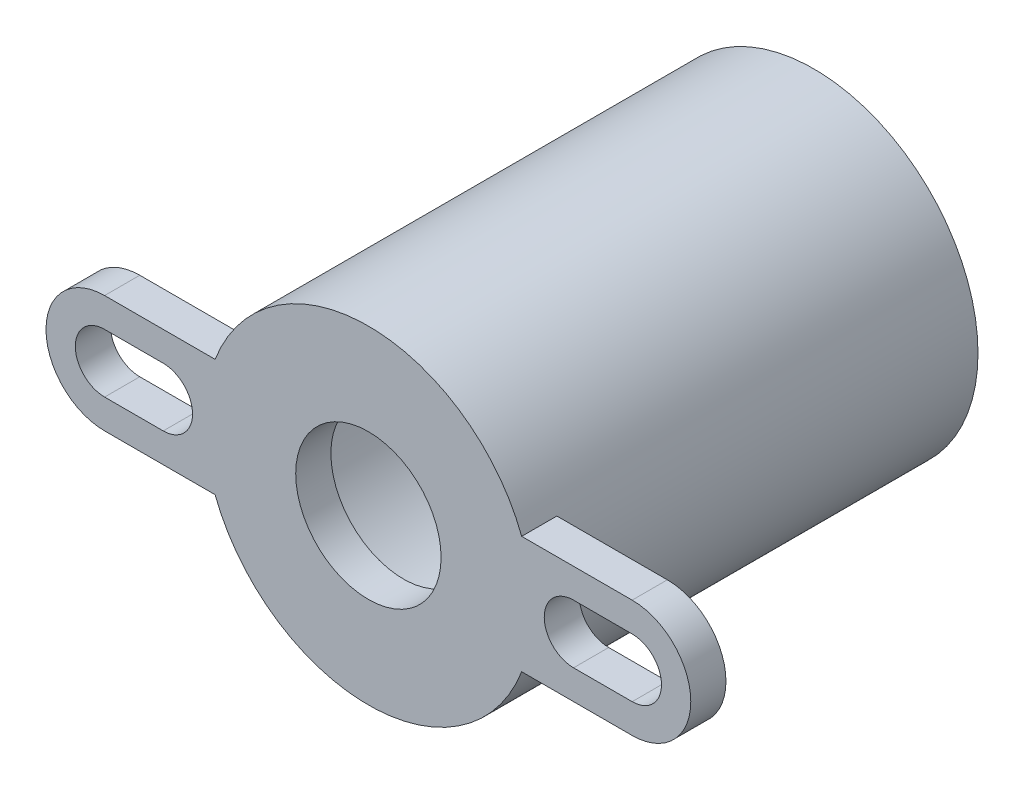
ISO-10303-21;
HEADER;
FILE_DESCRIPTION(('STEP AP214'),'2;1');
FILE_NAME('part.step','',(''),(''),'','','');
FILE_SCHEMA(('AUTOMOTIVE_DESIGN { 1 0 10303 214 1 1 1 1 }'));
ENDSEC;
DATA;
#1=APPLICATION_CONTEXT('core data for automotive mechanical design processes');
#2=APPLICATION_PROTOCOL_DEFINITION('international standard','automotive_design',2000,#1);
#3=PRODUCT_CONTEXT('',#1,'mechanical');
#4=PRODUCT('Part','Part','',(#3));
#5=PRODUCT_RELATED_PRODUCT_CATEGORY('part','',(#4));
#6=PRODUCT_DEFINITION_FORMATION('','',#4);
#7=PRODUCT_DEFINITION_CONTEXT('part definition',#1,'design');
#8=PRODUCT_DEFINITION('design','',#6,#7);
#9=PRODUCT_DEFINITION_SHAPE('','',#8);
#10=(LENGTH_UNIT() NAMED_UNIT(*) SI_UNIT(.MILLI.,.METRE.));
#11=(NAMED_UNIT(*) PLANE_ANGLE_UNIT() SI_UNIT($,.RADIAN.));
#12=(NAMED_UNIT(*) SI_UNIT($,.STERADIAN.) SOLID_ANGLE_UNIT());
#13=UNCERTAINTY_MEASURE_WITH_UNIT(LENGTH_MEASURE(1.E-05),#10,'distance_accuracy_value','');
#14=(GEOMETRIC_REPRESENTATION_CONTEXT(3) GLOBAL_UNCERTAINTY_ASSIGNED_CONTEXT((#13)) GLOBAL_UNIT_ASSIGNED_CONTEXT((#10,
#11,#12)) REPRESENTATION_CONTEXT('',''));
#15=CARTESIAN_POINT('',(0.,0.,0.));
#16=DIRECTION('',(0.,0.,1.));
#17=DIRECTION('',(1.,0.,0.));
#18=AXIS2_PLACEMENT_3D('',#15,#16,#17);
#19=CARTESIAN_POINT('',(0.,0.,0.));
#20=DIRECTION('',(0.,0.,1.));
#21=DIRECTION('',(1.,0.,0.));
#22=AXIS2_PLACEMENT_3D('',#19,#20,#21);
#23=PLANE('',#22);
#24=DIRECTION('',(1.,0.,0.));
#25=VECTOR('',#24,1.);
#26=CARTESIAN_POINT('',(40.,2.5,0.));
#27=LINE('',#26,#25);
#28=CARTESIAN_POINT('',(40.,2.5,0.));
#29=VERTEX_POINT('',#28);
#30=CARTESIAN_POINT('',(45.,2.5,0.));
#31=VERTEX_POINT('',#30);
#32=EDGE_CURVE('E179',#29,#31,#27,.T.);
#33=ORIENTED_EDGE('',*,*,#32,.F.);
#34=CARTESIAN_POINT('',(40.,0.,0.));
#35=DIRECTION('',(0.,0.,-1.));
#36=DIRECTION('',(-1.,0.,0.));
#37=AXIS2_PLACEMENT_3D('',#34,#35,#36);
#38=CIRCLE('',#37,2.5);
#39=CARTESIAN_POINT('',(40.,-2.5,0.));
#40=VERTEX_POINT('',#39);
#41=EDGE_CURVE('E54',#40,#29,#38,.T.);
#42=ORIENTED_EDGE('',*,*,#41,.F.);
#43=DIRECTION('',(-1.,0.,0.));
#44=VECTOR('',#43,1.);
#45=CARTESIAN_POINT('',(40.,-2.5,0.));
#46=LINE('',#45,#44);
#47=CARTESIAN_POINT('',(45.,-2.5,0.));
#48=VERTEX_POINT('',#47);
#49=EDGE_CURVE('E170',#48,#40,#46,.T.);
#50=ORIENTED_EDGE('',*,*,#49,.F.);
#51=CARTESIAN_POINT('',(45.,0.,0.));
#52=DIRECTION('',(0.,0.,-1.));
#53=DIRECTION('',(-1.,0.,0.));
#54=AXIS2_PLACEMENT_3D('',#51,#52,#53);
#55=CIRCLE('',#54,2.5);
#56=EDGE_CURVE('E173',#31,#48,#55,.T.);
#57=ORIENTED_EDGE('',*,*,#56,.F.);
#58=EDGE_LOOP('',(#33,#42,#50,#57));
#59=FACE_BOUND('',#58,.T.);
#60=CARTESIAN_POINT('',(22.5,0.,0.));
#61=DIRECTION('',(0.,0.,-1.));
#62=DIRECTION('',(-1.,0.,0.));
#63=AXIS2_PLACEMENT_3D('',#60,#61,#62);
#64=CIRCLE('',#63,14.);
#65=CARTESIAN_POINT('',(35.576696830622,5.,0.));
#66=VERTEX_POINT('',#65);
#67=CARTESIAN_POINT('',(35.576696830622,-5.,0.));
#68=VERTEX_POINT('',#67);
#69=EDGE_CURVE('E11',#66,#68,#64,.T.);
#70=ORIENTED_EDGE('',*,*,#69,.F.);
#71=DIRECTION('',(1.,0.,0.));
#72=VECTOR('',#71,1.);
#73=CARTESIAN_POINT('',(0.,5.,0.));
#74=LINE('',#73,#72);
#75=CARTESIAN_POINT('',(45.,5.,0.));
#76=VERTEX_POINT('',#75);
#77=EDGE_CURVE('E264',#66,#76,#74,.T.);
#78=ORIENTED_EDGE('',*,*,#77,.T.);
#79=CARTESIAN_POINT('',(45.,0.,0.));
#80=DIRECTION('',(0.,0.,1.));
#81=DIRECTION('',(1.,0.,0.));
#82=AXIS2_PLACEMENT_3D('',#79,#80,#81);
#83=CIRCLE('',#82,5.);
#84=CARTESIAN_POINT('',(45.,-5.,0.));
#85=VERTEX_POINT('',#84);
#86=EDGE_CURVE('E261',#85,#76,#83,.T.);
#87=ORIENTED_EDGE('',*,*,#86,.F.);
#88=DIRECTION('',(1.,0.,0.));
#89=VECTOR('',#88,1.);
#90=CARTESIAN_POINT('',(0.,-5.,0.));
#91=LINE('',#90,#89);
#92=EDGE_CURVE('E259',#68,#85,#91,.T.);
#93=ORIENTED_EDGE('',*,*,#92,.F.);
#94=EDGE_LOOP('',(#70,#78,#87,#93));
#95=FACE_BOUND('',#94,.T.);
#96=ADVANCED_FACE('F37',(#59,#95),#23,.F.);
#97=CARTESIAN_POINT('',(22.5,0.,0.));
#98=DIRECTION('',(0.,0.,-1.));
#99=DIRECTION('',(-1.,0.,0.));
#100=AXIS2_PLACEMENT_3D('',#97,#98,#99);
#101=CIRCLE('',#100,6.2);
#102=CARTESIAN_POINT('',(16.3,0.,0.));
#103=VERTEX_POINT('',#102);
#104=EDGE_CURVE('E228',#103,#103,#101,.T.);
#105=ORIENTED_EDGE('',*,*,#104,.F.);
#106=EDGE_LOOP('',(#105));
#107=FACE_BOUND('',#106,.T.);
#108=CARTESIAN_POINT('',(22.5,0.,0.));
#109=DIRECTION('',(0.,0.,-1.));
#110=DIRECTION('',(-1.,0.,0.));
#111=AXIS2_PLACEMENT_3D('',#108,#109,#110);
#112=CIRCLE('',#111,11.5);
#113=CARTESIAN_POINT('',(11.,0.,0.));
#114=VERTEX_POINT('',#113);
#115=EDGE_CURVE('E186',#114,#114,#112,.T.);
#116=ORIENTED_EDGE('',*,*,#115,.T.);
#117=EDGE_LOOP('',(#116));
#118=FACE_BOUND('',#117,.T.);
#119=ADVANCED_FACE('F334',(#107,#118),#23,.F.);
#120=CARTESIAN_POINT('',(0.,-5.,3.));
#121=DIRECTION('',(0.,1.,0.));
#122=DIRECTION('',(0.,0.,1.));
#123=AXIS2_PLACEMENT_3D('',#120,#121,#122);
#124=PLANE('',#123);
#125=DIRECTION('',(1.,0.,0.));
#126=VECTOR('',#125,1.);
#127=CARTESIAN_POINT('',(0.,-5.,0.));
#128=LINE('',#127,#126);
#129=CARTESIAN_POINT('',(0.,-5.,0.));
#130=VERTEX_POINT('',#129);
#131=CARTESIAN_POINT('',(9.42330316937798,-5.,0.));
#132=VERTEX_POINT('',#131);
#133=EDGE_CURVE('E235',#130,#132,#128,.T.);
#134=ORIENTED_EDGE('',*,*,#133,.T.);
#135=DIRECTION('',(0.,0.,-1.));
#136=VECTOR('',#135,1.);
#137=CARTESIAN_POINT('',(9.42330316937798,-5.,3.));
#138=LINE('',#137,#136);
#139=CARTESIAN_POINT('',(9.42330316937798,-5.,3.));
#140=VERTEX_POINT('',#139);
#141=EDGE_CURVE('E41',#140,#132,#138,.T.);
#142=ORIENTED_EDGE('',*,*,#141,.F.);
#143=DIRECTION('',(1.,0.,0.));
#144=VECTOR('',#143,1.);
#145=CARTESIAN_POINT('',(0.,-5.,3.));
#146=LINE('',#145,#144);
#147=CARTESIAN_POINT('',(0.,-5.,3.));
#148=VERTEX_POINT('',#147);
#149=EDGE_CURVE('E236',#148,#140,#146,.T.);
#150=ORIENTED_EDGE('',*,*,#149,.F.);
#151=DIRECTION('',(0.,0.,-1.));
#152=VECTOR('',#151,1.);
#153=CARTESIAN_POINT('',(0.,-5.,3.));
#154=LINE('',#153,#152);
#155=EDGE_CURVE('E256',#148,#130,#154,.T.);
#156=ORIENTED_EDGE('',*,*,#155,.T.);
#157=EDGE_LOOP('',(#134,#142,#150,#156));
#158=FACE_BOUND('',#157,.T.);
#159=ADVANCED_FACE('F39',(#158),#124,.F.);
#160=CARTESIAN_POINT('',(0.,-5.,3.));
#161=DIRECTION('',(0.,1.,0.));
#162=DIRECTION('',(0.,0.,1.));
#163=AXIS2_PLACEMENT_3D('',#160,#161,#162);
#164=PLANE('',#163);
#165=ORIENTED_EDGE('',*,*,#92,.T.);
#166=DIRECTION('',(0.,0.,-1.));
#167=VECTOR('',#166,1.);
#168=CARTESIAN_POINT('',(45.,-5.,3.));
#169=LINE('',#168,#167);
#170=CARTESIAN_POINT('',(45.,-5.,3.));
#171=VERTEX_POINT('',#170);
#172=EDGE_CURVE('E282',#171,#85,#169,.T.);
#173=ORIENTED_EDGE('',*,*,#172,.F.);
#174=DIRECTION('',(1.,0.,0.));
#175=VECTOR('',#174,1.);
#176=CARTESIAN_POINT('',(0.,-5.,3.));
#177=LINE('',#176,#175);
#178=CARTESIAN_POINT('',(35.576696830622,-5.,3.));
#179=VERTEX_POINT('',#178);
#180=EDGE_CURVE('E242',#179,#171,#177,.T.);
#181=ORIENTED_EDGE('',*,*,#180,.F.);
#182=DIRECTION('',(0.,0.,-1.));
#183=VECTOR('',#182,1.);
#184=CARTESIAN_POINT('',(35.576696830622,-5.,3.));
#185=LINE('',#184,#183);
#186=EDGE_CURVE('E284',#179,#68,#185,.T.);
#187=ORIENTED_EDGE('',*,*,#186,.T.);
#188=EDGE_LOOP('',(#165,#173,#181,#187));
#189=FACE_BOUND('',#188,.T.);
#190=ADVANCED_FACE('F316',(#189),#164,.F.);
#191=CARTESIAN_POINT('',(45.,0.,3.));
#192=DIRECTION('',(0.,0.,-1.));
#193=DIRECTION('',(-1.,0.,0.));
#194=AXIS2_PLACEMENT_3D('',#191,#192,#193);
#195=CYLINDRICAL_SURFACE('',#194,5.);
#196=ORIENTED_EDGE('',*,*,#86,.T.);
#197=DIRECTION('',(0.,0.,-1.));
#198=VECTOR('',#197,1.);
#199=CARTESIAN_POINT('',(45.,5.,3.));
#200=LINE('',#199,#198);
#201=CARTESIAN_POINT('',(45.,5.,3.));
#202=VERTEX_POINT('',#201);
#203=EDGE_CURVE('E280',#202,#76,#200,.T.);
#204=ORIENTED_EDGE('',*,*,#203,.F.);
#205=CARTESIAN_POINT('',(45.,0.,3.));
#206=DIRECTION('',(0.,0.,1.));
#207=DIRECTION('',(1.,0.,0.));
#208=AXIS2_PLACEMENT_3D('',#205,#206,#207);
#209=CIRCLE('',#208,5.);
#210=EDGE_CURVE('E244',#171,#202,#209,.T.);
#211=ORIENTED_EDGE('',*,*,#210,.F.);
#212=ORIENTED_EDGE('',*,*,#172,.T.);
#213=EDGE_LOOP('',(#196,#204,#211,#212));
#214=FACE_BOUND('',#213,.T.);
#215=ADVANCED_FACE('F319',(#214),#195,.T.);
#216=CARTESIAN_POINT('',(0.,5.,3.));
#217=DIRECTION('',(0.,1.,0.));
#218=DIRECTION('',(0.,0.,1.));
#219=AXIS2_PLACEMENT_3D('',#216,#217,#218);
#220=PLANE('',#219);
#221=ORIENTED_EDGE('',*,*,#77,.F.);
#222=DIRECTION('',(0.,0.,-1.));
#223=VECTOR('',#222,1.);
#224=CARTESIAN_POINT('',(35.576696830622,5.,3.));
#225=LINE('',#224,#223);
#226=CARTESIAN_POINT('',(35.576696830622,5.,3.));
#227=VERTEX_POINT('',#226);
#228=EDGE_CURVE('E277',#227,#66,#225,.T.);
#229=ORIENTED_EDGE('',*,*,#228,.F.);
#230=DIRECTION('',(1.,0.,0.));
#231=VECTOR('',#230,1.);
#232=CARTESIAN_POINT('',(0.,5.,3.));
#233=LINE('',#232,#231);
#234=EDGE_CURVE('E246',#227,#202,#233,.T.);
#235=ORIENTED_EDGE('',*,*,#234,.T.);
#236=ORIENTED_EDGE('',*,*,#203,.T.);
#237=EDGE_LOOP('',(#221,#229,#235,#236));
#238=FACE_BOUND('',#237,.T.);
#239=ADVANCED_FACE('F311',(#238),#220,.T.);
#240=CARTESIAN_POINT('',(22.5,0.,3.));
#241=DIRECTION('',(0.,0.,-1.));
#242=DIRECTION('',(-1.,0.,0.));
#243=AXIS2_PLACEMENT_3D('',#240,#241,#242);
#244=CYLINDRICAL_SURFACE('',#243,14.);
#245=ORIENTED_EDGE('',*,*,#228,.T.);
#246=ORIENTED_EDGE('',*,*,#69,.T.);
#247=ORIENTED_EDGE('',*,*,#186,.F.);
#248=CARTESIAN_POINT('',(22.5,0.,3.));
#249=DIRECTION('',(0.,0.,1.));
#250=DIRECTION('',(1.,0.,0.));
#251=AXIS2_PLACEMENT_3D('',#248,#249,#250);
#252=CIRCLE('',#251,14.);
#253=EDGE_CURVE('E239',#140,#179,#252,.T.);
#254=ORIENTED_EDGE('',*,*,#253,.F.);
#255=ORIENTED_EDGE('',*,*,#141,.T.);
#256=CARTESIAN_POINT('',(9.42330316937798,5.,0.));
#257=VERTEX_POINT('',#256);
#258=EDGE_CURVE('E46',#132,#257,#64,.T.);
#259=ORIENTED_EDGE('',*,*,#258,.T.);
#260=DIRECTION('',(0.,0.,-1.));
#261=VECTOR('',#260,1.);
#262=CARTESIAN_POINT('',(9.42330316937798,5.,3.));
#263=LINE('',#262,#261);
#264=CARTESIAN_POINT('',(9.42330316937798,5.,3.));
#265=VERTEX_POINT('',#264);
#266=EDGE_CURVE('E274',#265,#257,#263,.T.);
#267=ORIENTED_EDGE('',*,*,#266,.F.);
#268=CARTESIAN_POINT('',(22.5,0.,3.));
#269=DIRECTION('',(0.,0.,1.));
#270=DIRECTION('',(1.,0.,0.));
#271=AXIS2_PLACEMENT_3D('',#268,#269,#270);
#272=CIRCLE('',#271,14.);
#273=EDGE_CURVE('E249',#227,#265,#272,.T.);
#274=ORIENTED_EDGE('',*,*,#273,.F.);
#275=EDGE_LOOP('',(#245,#246,#247,#254,#255,#259,#267,#274));
#276=FACE_BOUND('',#275,.T.);
#277=CARTESIAN_POINT('',(22.5,0.,-35.));
#278=DIRECTION('',(0.,0.,-1.));
#279=DIRECTION('',(-1.,0.,0.));
#280=AXIS2_PLACEMENT_3D('',#277,#278,#279);
#281=CIRCLE('',#280,14.);
#282=CARTESIAN_POINT('',(8.5,0.,-35.));
#283=VERTEX_POINT('',#282);
#284=EDGE_CURVE('E224',#283,#283,#281,.T.);
#285=ORIENTED_EDGE('',*,*,#284,.F.);
#286=EDGE_LOOP('',(#285));
#287=FACE_BOUND('',#286,.T.);
#288=ADVANCED_FACE('F294',(#276,#287),#244,.T.);
#289=CARTESIAN_POINT('',(0.,5.,3.));
#290=DIRECTION('',(0.,1.,0.));
#291=DIRECTION('',(0.,0.,1.));
#292=AXIS2_PLACEMENT_3D('',#289,#290,#291);
#293=PLANE('',#292);
#294=DIRECTION('',(1.,0.,0.));
#295=VECTOR('',#294,1.);
#296=CARTESIAN_POINT('',(0.,5.,0.));
#297=LINE('',#296,#295);
#298=CARTESIAN_POINT('',(0.,5.,0.));
#299=VERTEX_POINT('',#298);
#300=EDGE_CURVE('E267',#299,#257,#297,.T.);
#301=ORIENTED_EDGE('',*,*,#300,.F.);
#302=DIRECTION('',(0.,0.,-1.));
#303=VECTOR('',#302,1.);
#304=CARTESIAN_POINT('',(0.,5.,3.));
#305=LINE('',#304,#303);
#306=CARTESIAN_POINT('',(0.,5.,3.));
#307=VERTEX_POINT('',#306);
#308=EDGE_CURVE('E272',#307,#299,#305,.T.);
#309=ORIENTED_EDGE('',*,*,#308,.F.);
#310=DIRECTION('',(1.,0.,0.));
#311=VECTOR('',#310,1.);
#312=CARTESIAN_POINT('',(0.,5.,3.));
#313=LINE('',#312,#311);
#314=EDGE_CURVE('E251',#307,#265,#313,.T.);
#315=ORIENTED_EDGE('',*,*,#314,.T.);
#316=ORIENTED_EDGE('',*,*,#266,.T.);
#317=EDGE_LOOP('',(#301,#309,#315,#316));
#318=FACE_BOUND('',#317,.T.);
#319=ADVANCED_FACE('F303',(#318),#293,.T.);
#320=CARTESIAN_POINT('',(0.,0.,3.));
#321=DIRECTION('',(0.,0.,-1.));
#322=DIRECTION('',(-1.,0.,0.));
#323=AXIS2_PLACEMENT_3D('',#320,#321,#322);
#324=CYLINDRICAL_SURFACE('',#323,5.);
#325=CARTESIAN_POINT('',(0.,0.,0.));
#326=DIRECTION('',(0.,0.,1.));
#327=DIRECTION('',(1.,0.,0.));
#328=AXIS2_PLACEMENT_3D('',#325,#326,#327);
#329=CIRCLE('',#328,5.);
#330=EDGE_CURVE('E240',#299,#130,#329,.T.);
#331=ORIENTED_EDGE('',*,*,#330,.T.);
#332=ORIENTED_EDGE('',*,*,#155,.F.);
#333=CARTESIAN_POINT('',(0.,0.,3.));
#334=DIRECTION('',(0.,0.,1.));
#335=DIRECTION('',(1.,0.,0.));
#336=AXIS2_PLACEMENT_3D('',#333,#334,#335);
#337=CIRCLE('',#336,5.);
#338=EDGE_CURVE('E254',#307,#148,#337,.T.);
#339=ORIENTED_EDGE('',*,*,#338,.F.);
#340=ORIENTED_EDGE('',*,*,#308,.T.);
#341=EDGE_LOOP('',(#331,#332,#339,#340));
#342=FACE_BOUND('',#341,.T.);
#343=ADVANCED_FACE('F323',(#342),#324,.T.);
#344=CARTESIAN_POINT('',(0.,0.,3.));
#345=DIRECTION('',(0.,0.,1.));
#346=DIRECTION('',(1.,0.,0.));
#347=AXIS2_PLACEMENT_3D('',#344,#345,#346);
#348=PLANE('',#347);
#349=CARTESIAN_POINT('',(40.,0.,3.));
#350=DIRECTION('',(0.,0.,-1.));
#351=DIRECTION('',(-1.,0.,0.));
#352=AXIS2_PLACEMENT_3D('',#349,#350,#351);
#353=CIRCLE('',#352,2.5);
#354=CARTESIAN_POINT('',(40.,-2.5,3.));
#355=VERTEX_POINT('',#354);
#356=CARTESIAN_POINT('',(40.,2.5,3.));
#357=VERTEX_POINT('',#356);
#358=EDGE_CURVE('E154',#355,#357,#353,.T.);
#359=ORIENTED_EDGE('',*,*,#358,.T.);
#360=DIRECTION('',(1.,0.,0.));
#361=VECTOR('',#360,1.);
#362=CARTESIAN_POINT('',(40.,2.5,3.));
#363=LINE('',#362,#361);
#364=CARTESIAN_POINT('',(45.,2.5,3.));
#365=VERTEX_POINT('',#364);
#366=EDGE_CURVE('E163',#357,#365,#363,.T.);
#367=ORIENTED_EDGE('',*,*,#366,.T.);
#368=CARTESIAN_POINT('',(45.,0.,3.));
#369=DIRECTION('',(0.,0.,-1.));
#370=DIRECTION('',(-1.,0.,0.));
#371=AXIS2_PLACEMENT_3D('',#368,#369,#370);
#372=CIRCLE('',#371,2.5);
#373=CARTESIAN_POINT('',(45.,-2.5,3.));
#374=VERTEX_POINT('',#373);
#375=EDGE_CURVE('E62',#365,#374,#372,.T.);
#376=ORIENTED_EDGE('',*,*,#375,.T.);
#377=DIRECTION('',(-1.,0.,0.));
#378=VECTOR('',#377,1.);
#379=CARTESIAN_POINT('',(40.,-2.5,3.));
#380=LINE('',#379,#378);
#381=EDGE_CURVE('E160',#374,#355,#380,.T.);
#382=ORIENTED_EDGE('',*,*,#381,.T.);
#383=EDGE_LOOP('',(#359,#367,#376,#382));
#384=FACE_BOUND('',#383,.T.);
#385=CARTESIAN_POINT('',(5.,0.,3.));
#386=DIRECTION('',(0.,0.,-1.));
#387=DIRECTION('',(-1.,0.,0.));
#388=AXIS2_PLACEMENT_3D('',#385,#386,#387);
#389=CIRCLE('',#388,2.5);
#390=CARTESIAN_POINT('',(5.,2.5,3.));
#391=VERTEX_POINT('',#390);
#392=CARTESIAN_POINT('',(5.,-2.5,3.));
#393=VERTEX_POINT('',#392);
#394=EDGE_CURVE('E190',#391,#393,#389,.T.);
#395=ORIENTED_EDGE('',*,*,#394,.T.);
#396=DIRECTION('',(-1.,0.,0.));
#397=VECTOR('',#396,1.);
#398=CARTESIAN_POINT('',(5.,-2.5,3.));
#399=LINE('',#398,#397);
#400=CARTESIAN_POINT('',(0.,-2.5,3.));
#401=VERTEX_POINT('',#400);
#402=EDGE_CURVE('E193',#393,#401,#399,.T.);
#403=ORIENTED_EDGE('',*,*,#402,.T.);
#404=CARTESIAN_POINT('',(0.,0.,3.));
#405=DIRECTION('',(0.,0.,-1.));
#406=DIRECTION('',(-1.,0.,0.));
#407=AXIS2_PLACEMENT_3D('',#404,#405,#406);
#408=CIRCLE('',#407,2.5);
#409=CARTESIAN_POINT('',(0.,2.5,3.));
#410=VERTEX_POINT('',#409);
#411=EDGE_CURVE('E197',#401,#410,#408,.T.);
#412=ORIENTED_EDGE('',*,*,#411,.T.);
#413=DIRECTION('',(1.,0.,0.));
#414=VECTOR('',#413,1.);
#415=CARTESIAN_POINT('',(5.,2.5,3.));
#416=LINE('',#415,#414);
#417=EDGE_CURVE('E200',#410,#391,#416,.T.);
#418=ORIENTED_EDGE('',*,*,#417,.T.);
#419=EDGE_LOOP('',(#395,#403,#412,#418));
#420=FACE_BOUND('',#419,.T.);
#421=CARTESIAN_POINT('',(22.5,0.,3.));
#422=DIRECTION('',(0.,0.,1.));
#423=DIRECTION('',(1.,0.,0.));
#424=AXIS2_PLACEMENT_3D('',#421,#422,#423);
#425=CIRCLE('',#424,6.2);
#426=CARTESIAN_POINT('',(28.7,0.,3.));
#427=VERTEX_POINT('',#426);
#428=EDGE_CURVE('E232',#427,#427,#425,.T.);
#429=ORIENTED_EDGE('',*,*,#428,.F.);
#430=EDGE_LOOP('',(#429));
#431=FACE_BOUND('',#430,.T.);
#432=ORIENTED_EDGE('',*,*,#149,.T.);
#433=ORIENTED_EDGE('',*,*,#253,.T.);
#434=ORIENTED_EDGE('',*,*,#180,.T.);
#435=ORIENTED_EDGE('',*,*,#210,.T.);
#436=ORIENTED_EDGE('',*,*,#234,.F.);
#437=ORIENTED_EDGE('',*,*,#273,.T.);
#438=ORIENTED_EDGE('',*,*,#314,.F.);
#439=ORIENTED_EDGE('',*,*,#338,.T.);
#440=EDGE_LOOP('',(#432,#433,#434,#435,#436,#437,#438,#439));
#441=FACE_BOUND('',#440,.T.);
#442=ADVANCED_FACE('F167',(#384,#420,#431,#441),#348,.T.);
#443=DIRECTION('',(-1.,0.,0.));
#444=VECTOR('',#443,1.);
#445=CARTESIAN_POINT('',(5.,-2.5,0.));
#446=LINE('',#445,#444);
#447=CARTESIAN_POINT('',(5.,-2.5,0.));
#448=VERTEX_POINT('',#447);
#449=CARTESIAN_POINT('',(0.,-2.5,0.));
#450=VERTEX_POINT('',#449);
#451=EDGE_CURVE('E206',#448,#450,#446,.T.);
#452=ORIENTED_EDGE('',*,*,#451,.F.);
#453=CARTESIAN_POINT('',(5.,0.,0.));
#454=DIRECTION('',(0.,0.,-1.));
#455=DIRECTION('',(-1.,0.,0.));
#456=AXIS2_PLACEMENT_3D('',#453,#454,#455);
#457=CIRCLE('',#456,2.5);
#458=CARTESIAN_POINT('',(5.,2.5,0.));
#459=VERTEX_POINT('',#458);
#460=EDGE_CURVE('E204',#459,#448,#457,.T.);
#461=ORIENTED_EDGE('',*,*,#460,.F.);
#462=DIRECTION('',(1.,0.,0.));
#463=VECTOR('',#462,1.);
#464=CARTESIAN_POINT('',(5.,2.5,0.));
#465=LINE('',#464,#463);
#466=CARTESIAN_POINT('',(0.,2.5,0.));
#467=VERTEX_POINT('',#466);
#468=EDGE_CURVE('E194',#467,#459,#465,.T.);
#469=ORIENTED_EDGE('',*,*,#468,.F.);
#470=CARTESIAN_POINT('',(0.,0.,0.));
#471=DIRECTION('',(0.,0.,-1.));
#472=DIRECTION('',(-1.,0.,0.));
#473=AXIS2_PLACEMENT_3D('',#470,#471,#472);
#474=CIRCLE('',#473,2.5);
#475=EDGE_CURVE('E209',#450,#467,#474,.T.);
#476=ORIENTED_EDGE('',*,*,#475,.F.);
#477=EDGE_LOOP('',(#452,#461,#469,#476));
#478=FACE_BOUND('',#477,.T.);
#479=ORIENTED_EDGE('',*,*,#258,.F.);
#480=ORIENTED_EDGE('',*,*,#133,.F.);
#481=ORIENTED_EDGE('',*,*,#330,.F.);
#482=ORIENTED_EDGE('',*,*,#300,.T.);
#483=EDGE_LOOP('',(#479,#480,#481,#482));
#484=FACE_BOUND('',#483,.T.);
#485=ADVANCED_FACE('F299',(#478,#484),#23,.F.);
#486=CARTESIAN_POINT('',(22.5,0.,8.));
#487=DIRECTION('',(0.,0.,-1.));
#488=DIRECTION('',(-1.,0.,0.));
#489=AXIS2_PLACEMENT_3D('',#486,#487,#488);
#490=CYLINDRICAL_SURFACE('',#489,6.2);
#491=ORIENTED_EDGE('',*,*,#428,.T.);
#492=EDGE_LOOP('',(#491));
#493=FACE_BOUND('',#492,.T.);
#494=ORIENTED_EDGE('',*,*,#104,.T.);
#495=EDGE_LOOP('',(#494));
#496=FACE_BOUND('',#495,.T.);
#497=ADVANCED_FACE('F341',(#493,#496),#490,.F.);
#498=CARTESIAN_POINT('',(22.5,0.,-35.));
#499=DIRECTION('',(0.,0.,-1.));
#500=DIRECTION('',(-1.,0.,0.));
#501=AXIS2_PLACEMENT_3D('',#498,#499,#500);
#502=PLANE('',#501);
#503=ORIENTED_EDGE('',*,*,#284,.T.);
#504=EDGE_LOOP('',(#503));
#505=FACE_BOUND('',#504,.T.);
#506=CARTESIAN_POINT('',(22.5,0.,-35.));
#507=DIRECTION('',(0.,0.,-1.));
#508=DIRECTION('',(-1.,0.,0.));
#509=AXIS2_PLACEMENT_3D('',#506,#507,#508);
#510=CIRCLE('',#509,11.5);
#511=CARTESIAN_POINT('',(11.,0.,-35.));
#512=VERTEX_POINT('',#511);
#513=EDGE_CURVE('E221',#512,#512,#510,.T.);
#514=ORIENTED_EDGE('',*,*,#513,.F.);
#515=EDGE_LOOP('',(#514));
#516=FACE_BOUND('',#515,.T.);
#517=ADVANCED_FACE('F346',(#505,#516),#502,.T.);
#518=CARTESIAN_POINT('',(22.5,0.,-35.));
#519=DIRECTION('',(0.,0.,1.));
#520=DIRECTION('',(1.,0.,0.));
#521=AXIS2_PLACEMENT_3D('',#518,#519,#520);
#522=CYLINDRICAL_SURFACE('',#521,11.5);
#523=ORIENTED_EDGE('',*,*,#513,.T.);
#524=EDGE_LOOP('',(#523));
#525=FACE_BOUND('',#524,.T.);
#526=ORIENTED_EDGE('',*,*,#115,.F.);
#527=EDGE_LOOP('',(#526));
#528=FACE_BOUND('',#527,.T.);
#529=ADVANCED_FACE('F372',(#525,#528),#522,.F.);
#530=CARTESIAN_POINT('',(5.,0.,3.));
#531=DIRECTION('',(0.,0.,-1.));
#532=DIRECTION('',(-1.,0.,0.));
#533=AXIS2_PLACEMENT_3D('',#530,#531,#532);
#534=CYLINDRICAL_SURFACE('',#533,2.5);
#535=ORIENTED_EDGE('',*,*,#460,.T.);
#536=DIRECTION('',(0.,0.,-1.));
#537=VECTOR('',#536,1.);
#538=CARTESIAN_POINT('',(5.,-2.5,3.));
#539=LINE('',#538,#537);
#540=EDGE_CURVE('E203',#393,#448,#539,.T.);
#541=ORIENTED_EDGE('',*,*,#540,.F.);
#542=ORIENTED_EDGE('',*,*,#394,.F.);
#543=DIRECTION('',(0.,0.,-1.));
#544=VECTOR('',#543,1.);
#545=CARTESIAN_POINT('',(5.,2.5,3.));
#546=LINE('',#545,#544);
#547=EDGE_CURVE('E180',#391,#459,#546,.T.);
#548=ORIENTED_EDGE('',*,*,#547,.T.);
#549=EDGE_LOOP('',(#535,#541,#542,#548));
#550=FACE_BOUND('',#549,.T.);
#551=ADVANCED_FACE('F359',(#550),#534,.F.);
#552=CARTESIAN_POINT('',(5.,2.5,3.));
#553=DIRECTION('',(0.,1.,0.));
#554=DIRECTION('',(0.,0.,1.));
#555=AXIS2_PLACEMENT_3D('',#552,#553,#554);
#556=PLANE('',#555);
#557=ORIENTED_EDGE('',*,*,#468,.T.);
#558=ORIENTED_EDGE('',*,*,#547,.F.);
#559=ORIENTED_EDGE('',*,*,#417,.F.);
#560=DIRECTION('',(0.,0.,-1.));
#561=VECTOR('',#560,1.);
#562=CARTESIAN_POINT('',(0.,2.5,3.));
#563=LINE('',#562,#561);
#564=EDGE_CURVE('E215',#410,#467,#563,.T.);
#565=ORIENTED_EDGE('',*,*,#564,.T.);
#566=EDGE_LOOP('',(#557,#558,#559,#565));
#567=FACE_BOUND('',#566,.T.);
#568=ADVANCED_FACE('F362',(#567),#556,.F.);
#569=CARTESIAN_POINT('',(0.,0.,3.));
#570=DIRECTION('',(0.,0.,-1.));
#571=DIRECTION('',(-1.,0.,0.));
#572=AXIS2_PLACEMENT_3D('',#569,#570,#571);
#573=CYLINDRICAL_SURFACE('',#572,2.5);
#574=ORIENTED_EDGE('',*,*,#475,.T.);
#575=ORIENTED_EDGE('',*,*,#564,.F.);
#576=ORIENTED_EDGE('',*,*,#411,.F.);
#577=DIRECTION('',(0.,0.,-1.));
#578=VECTOR('',#577,1.);
#579=CARTESIAN_POINT('',(0.,-2.5,3.));
#580=LINE('',#579,#578);
#581=EDGE_CURVE('E217',#401,#450,#580,.T.);
#582=ORIENTED_EDGE('',*,*,#581,.T.);
#583=EDGE_LOOP('',(#574,#575,#576,#582));
#584=FACE_BOUND('',#583,.T.);
#585=ADVANCED_FACE('F364',(#584),#573,.F.);
#586=CARTESIAN_POINT('',(5.,-2.5,3.));
#587=DIRECTION('',(0.,-1.,0.));
#588=DIRECTION('',(0.,0.,-1.));
#589=AXIS2_PLACEMENT_3D('',#586,#587,#588);
#590=PLANE('',#589);
#591=ORIENTED_EDGE('',*,*,#451,.T.);
#592=ORIENTED_EDGE('',*,*,#581,.F.);
#593=ORIENTED_EDGE('',*,*,#402,.F.);
#594=ORIENTED_EDGE('',*,*,#540,.T.);
#595=EDGE_LOOP('',(#591,#592,#593,#594));
#596=FACE_BOUND('',#595,.T.);
#597=ADVANCED_FACE('F355',(#596),#590,.F.);
#598=CARTESIAN_POINT('',(40.,0.,3.));
#599=DIRECTION('',(0.,0.,-1.));
#600=DIRECTION('',(-1.,0.,0.));
#601=AXIS2_PLACEMENT_3D('',#598,#599,#600);
#602=CYLINDRICAL_SURFACE('',#601,2.5);
#603=ORIENTED_EDGE('',*,*,#41,.T.);
#604=DIRECTION('',(0.,0.,-1.));
#605=VECTOR('',#604,1.);
#606=CARTESIAN_POINT('',(40.,2.5,3.));
#607=LINE('',#606,#605);
#608=EDGE_CURVE('E150',#357,#29,#607,.T.);
#609=ORIENTED_EDGE('',*,*,#608,.F.);
#610=ORIENTED_EDGE('',*,*,#358,.F.);
#611=DIRECTION('',(0.,0.,-1.));
#612=VECTOR('',#611,1.);
#613=CARTESIAN_POINT('',(40.,-2.5,3.));
#614=LINE('',#613,#612);
#615=EDGE_CURVE('E184',#355,#40,#614,.T.);
#616=ORIENTED_EDGE('',*,*,#615,.T.);
#617=EDGE_LOOP('',(#603,#609,#610,#616));
#618=FACE_BOUND('',#617,.T.);
#619=ADVANCED_FACE('F152',(#618),#602,.F.);
#620=CARTESIAN_POINT('',(40.,-2.5,3.));
#621=DIRECTION('',(0.,-1.,0.));
#622=DIRECTION('',(0.,0.,-1.));
#623=AXIS2_PLACEMENT_3D('',#620,#621,#622);
#624=PLANE('',#623);
#625=ORIENTED_EDGE('',*,*,#49,.T.);
#626=ORIENTED_EDGE('',*,*,#615,.F.);
#627=ORIENTED_EDGE('',*,*,#381,.F.);
#628=DIRECTION('',(0.,0.,-1.));
#629=VECTOR('',#628,1.);
#630=CARTESIAN_POINT('',(45.,-2.5,3.));
#631=LINE('',#630,#629);
#632=EDGE_CURVE('E187',#374,#48,#631,.T.);
#633=ORIENTED_EDGE('',*,*,#632,.T.);
#634=EDGE_LOOP('',(#625,#626,#627,#633));
#635=FACE_BOUND('',#634,.T.);
#636=ADVANCED_FACE('F392',(#635),#624,.F.);
#637=CARTESIAN_POINT('',(45.,0.,3.));
#638=DIRECTION('',(0.,0.,-1.));
#639=DIRECTION('',(-1.,0.,0.));
#640=AXIS2_PLACEMENT_3D('',#637,#638,#639);
#641=CYLINDRICAL_SURFACE('',#640,2.5);
#642=ORIENTED_EDGE('',*,*,#56,.T.);
#643=ORIENTED_EDGE('',*,*,#632,.F.);
#644=ORIENTED_EDGE('',*,*,#375,.F.);
#645=DIRECTION('',(0.,0.,-1.));
#646=VECTOR('',#645,1.);
#647=CARTESIAN_POINT('',(45.,2.5,3.));
#648=LINE('',#647,#646);
#649=EDGE_CURVE('E159',#365,#31,#648,.T.);
#650=ORIENTED_EDGE('',*,*,#649,.T.);
#651=EDGE_LOOP('',(#642,#643,#644,#650));
#652=FACE_BOUND('',#651,.T.);
#653=ADVANCED_FACE('F395',(#652),#641,.F.);
#654=CARTESIAN_POINT('',(40.,2.5,3.));
#655=DIRECTION('',(0.,1.,0.));
#656=DIRECTION('',(-1.,0.,0.));
#657=AXIS2_PLACEMENT_3D('',#654,#655,#656);
#658=PLANE('',#657);
#659=ORIENTED_EDGE('',*,*,#32,.T.);
#660=ORIENTED_EDGE('',*,*,#649,.F.);
#661=ORIENTED_EDGE('',*,*,#366,.F.);
#662=ORIENTED_EDGE('',*,*,#608,.T.);
#663=EDGE_LOOP('',(#659,#660,#661,#662));
#664=FACE_BOUND('',#663,.T.);
#665=ADVANCED_FACE('F164',(#664),#658,.F.);
#666=CLOSED_SHELL('',(#96,#119,#159,#190,#215,#239,#288,#319,#343,#442,#485,#497,#517,#529,#551,
#568,#585,#597,#619,#636,#653,#665));
#667=MANIFOLD_SOLID_BREP('B2',#666);
#668=ADVANCED_BREP_SHAPE_REPRESENTATION('',(#18,#667),#14);
#669=SHAPE_DEFINITION_REPRESENTATION(#9,#668);
ENDSEC;
END-ISO-10303-21;
